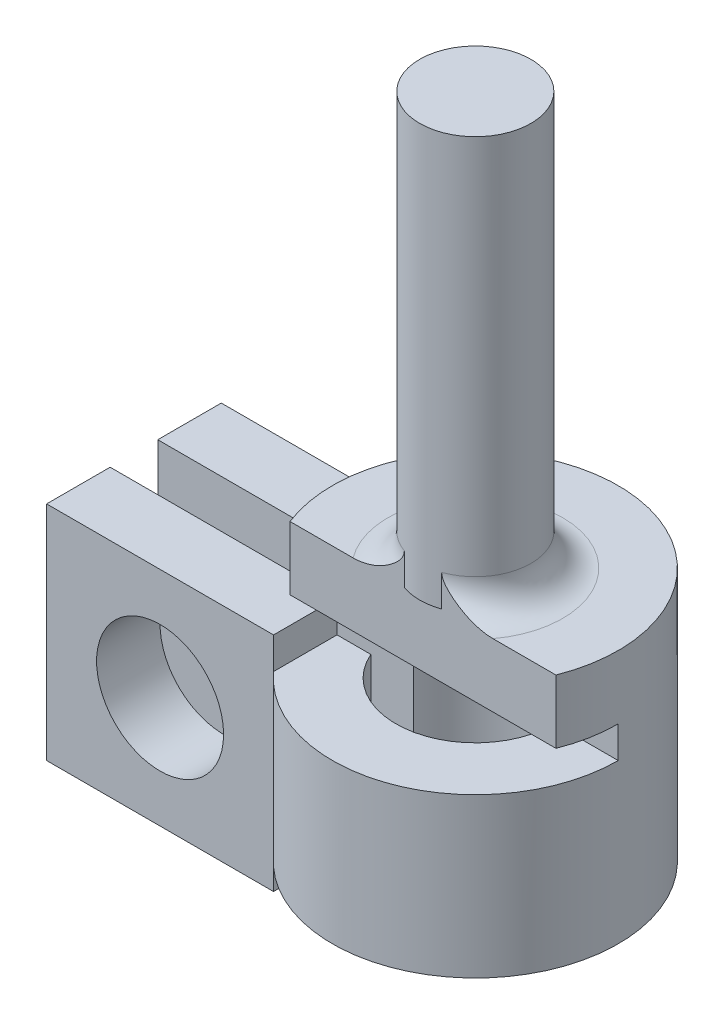
ISO-10303-21;
HEADER;
FILE_DESCRIPTION(('STEP AP214'),'2;1');
FILE_NAME('part.step','',(''),(''),'','','');
FILE_SCHEMA(('AUTOMOTIVE_DESIGN { 1 0 10303 214 1 1 1 1 }'));
ENDSEC;
DATA;
#1=APPLICATION_CONTEXT('core data for automotive mechanical design processes');
#2=APPLICATION_PROTOCOL_DEFINITION('international standard','automotive_design',2000,#1);
#3=PRODUCT_CONTEXT('',#1,'mechanical');
#4=PRODUCT('Part','Part','',(#3));
#5=PRODUCT_RELATED_PRODUCT_CATEGORY('part','',(#4));
#6=PRODUCT_DEFINITION_FORMATION('','',#4);
#7=PRODUCT_DEFINITION_CONTEXT('part definition',#1,'design');
#8=PRODUCT_DEFINITION('design','',#6,#7);
#9=PRODUCT_DEFINITION_SHAPE('','',#8);
#10=(LENGTH_UNIT() NAMED_UNIT(*) SI_UNIT(.MILLI.,.METRE.));
#11=(NAMED_UNIT(*) PLANE_ANGLE_UNIT() SI_UNIT($,.RADIAN.));
#12=(NAMED_UNIT(*) SI_UNIT($,.STERADIAN.) SOLID_ANGLE_UNIT());
#13=UNCERTAINTY_MEASURE_WITH_UNIT(LENGTH_MEASURE(1.E-05),#10,'distance_accuracy_value','');
#14=(GEOMETRIC_REPRESENTATION_CONTEXT(3) GLOBAL_UNCERTAINTY_ASSIGNED_CONTEXT((#13)) GLOBAL_UNIT_ASSIGNED_CONTEXT((#10,
#11,#12)) REPRESENTATION_CONTEXT('',''));
#15=CARTESIAN_POINT('',(0.,0.,0.));
#16=DIRECTION('',(0.,0.,1.));
#17=DIRECTION('',(1.,0.,0.));
#18=AXIS2_PLACEMENT_3D('',#15,#16,#17);
#19=CARTESIAN_POINT('',(0.,5.,0.));
#20=DIRECTION('',(0.,1.,0.));
#21=DIRECTION('',(0.,0.,1.));
#22=AXIS2_PLACEMENT_3D('',#19,#20,#21);
#23=PLANE('',#22);
#24=CARTESIAN_POINT('',(0.,5.,0.));
#25=DIRECTION('',(0.,1.,0.));
#26=DIRECTION('',(0.,0.,1.));
#27=AXIS2_PLACEMENT_3D('',#24,#25,#26);
#28=CIRCLE('',#27,4.5);
#29=CARTESIAN_POINT('',(-3.35410196624968,5.,3.));
#30=VERTEX_POINT('',#29);
#31=CARTESIAN_POINT('',(4.5,5.,0.));
#32=VERTEX_POINT('',#31);
#33=EDGE_CURVE('E391',#30,#32,#28,.T.);
#34=ORIENTED_EDGE('',*,*,#33,.T.);
#35=DIRECTION('',(1.,0.,0.));
#36=VECTOR('',#35,1.);
#37=CARTESIAN_POINT('',(4.5,5.,0.));
#38=LINE('',#37,#36);
#39=CARTESIAN_POINT('',(2.5,5.,0.));
#40=VERTEX_POINT('',#39);
#41=EDGE_CURVE('E269',#40,#32,#38,.T.);
#42=ORIENTED_EDGE('',*,*,#41,.F.);
#43=CARTESIAN_POINT('',(0.,5.,0.));
#44=DIRECTION('',(0.,-1.,0.));
#45=DIRECTION('',(0.,0.,1.));
#46=AXIS2_PLACEMENT_3D('',#43,#44,#45);
#47=CIRCLE('',#46,2.5);
#48=CARTESIAN_POINT('',(-2.29128784747792,5.,1.));
#49=VERTEX_POINT('',#48);
#50=EDGE_CURVE('E394',#40,#49,#47,.T.);
#51=ORIENTED_EDGE('',*,*,#50,.T.);
#52=DIRECTION('',(-1.,0.,0.));
#53=VECTOR('',#52,1.);
#54=CARTESIAN_POINT('',(-2.29128784747792,5.,1.));
#55=LINE('',#54,#53);
#56=CARTESIAN_POINT('',(-3.35410196624968,5.,1.));
#57=VERTEX_POINT('',#56);
#58=EDGE_CURVE('E398',#49,#57,#55,.T.);
#59=ORIENTED_EDGE('',*,*,#58,.T.);
#60=DIRECTION('',(0.,0.,1.));
#61=VECTOR('',#60,1.);
#62=CARTESIAN_POINT('',(-3.35410196624968,5.,-9.71552899715306));
#63=LINE('',#62,#61);
#64=EDGE_CURVE('E382',#57,#30,#63,.T.);
#65=ORIENTED_EDGE('',*,*,#64,.T.);
#66=EDGE_LOOP('',(#34,#42,#51,#59,#65));
#67=FACE_BOUND('',#66,.T.);
#68=ADVANCED_FACE('F39',(#67),#23,.T.);
#69=DIRECTION('',(-1.,0.,0.));
#70=VECTOR('',#69,1.);
#71=CARTESIAN_POINT('',(-10.5,5.,-2.5));
#72=LINE('',#71,#70);
#73=CARTESIAN_POINT('',(-3.69307071470621,5.,-2.5));
#74=VERTEX_POINT('',#73);
#75=CARTESIAN_POINT('',(-3.74165738677394,5.,-2.5));
#76=VERTEX_POINT('',#75);
#77=EDGE_CURVE('E365',#74,#76,#72,.T.);
#78=ORIENTED_EDGE('',*,*,#77,.F.);
#79=DIRECTION('',(-0.234521074707626,0.,0.972111035591089));
#80=VECTOR('',#79,1.);
#81=CARTESIAN_POINT('',(-4.17556924855944,5.,-0.499999999999998));
#82=LINE('',#81,#80);
#83=CARTESIAN_POINT('',(-3.66692263001969,5.,-2.60838617260741));
#84=VERTEX_POINT('',#83);
#85=EDGE_CURVE('E260',#84,#74,#82,.T.);
#86=ORIENTED_EDGE('',*,*,#85,.F.);
#87=EDGE_CURVE('E395',#84,#76,#28,.T.);
#88=ORIENTED_EDGE('',*,*,#87,.T.);
#89=EDGE_LOOP('',(#78,#86,#88));
#90=FACE_BOUND('',#89,.T.);
#91=ADVANCED_FACE('F503',(#90),#23,.T.);
#92=CARTESIAN_POINT('',(-3.74165738677394,5.,-2.5));
#93=DIRECTION('',(0.,0.,1.));
#94=DIRECTION('',(1.,0.,0.));
#95=AXIS2_PLACEMENT_3D('',#92,#93,#94);
#96=PLANE('',#95);
#97=CARTESIAN_POINT('',(-6.92705098312484,2.5,-2.5));
#98=DIRECTION('',(0.,0.,1.));
#99=DIRECTION('',(1.,0.,0.));
#100=AXIS2_PLACEMENT_3D('',#97,#98,#99);
#101=CIRCLE('',#100,2.);
#102=CARTESIAN_POINT('',(-4.92705098312484,2.5,-2.5));
#103=VERTEX_POINT('',#102);
#104=EDGE_CURVE('E303',#103,#103,#101,.T.);
#105=ORIENTED_EDGE('',*,*,#104,.T.);
#106=EDGE_LOOP('',(#105));
#107=FACE_BOUND('',#106,.T.);
#108=DIRECTION('',(0.,1.,0.));
#109=VECTOR('',#108,1.);
#110=CARTESIAN_POINT('',(-3.6930707147062,5.,-2.5));
#111=LINE('',#110,#109);
#112=CARTESIAN_POINT('',(-3.69307071470621,6.,-2.5));
#113=VERTEX_POINT('',#112);
#114=EDGE_CURVE('E287',#74,#113,#111,.T.);
#115=ORIENTED_EDGE('',*,*,#114,.F.);
#116=ORIENTED_EDGE('',*,*,#77,.T.);
#117=DIRECTION('',(0.,-1.,0.));
#118=VECTOR('',#117,1.);
#119=CARTESIAN_POINT('',(-3.74165738677394,5.,-2.5));
#120=LINE('',#119,#118);
#121=CARTESIAN_POINT('',(-3.74165738677394,0.,-2.5));
#122=VERTEX_POINT('',#121);
#123=EDGE_CURVE('E386',#76,#122,#120,.T.);
#124=ORIENTED_EDGE('',*,*,#123,.T.);
#125=DIRECTION('',(1.,0.,0.));
#126=VECTOR('',#125,1.);
#127=CARTESIAN_POINT('',(-10.5,0.,-2.5));
#128=LINE('',#127,#126);
#129=CARTESIAN_POINT('',(-3.35410196624968,0.,-2.5));
#130=VERTEX_POINT('',#129);
#131=EDGE_CURVE('E331',#122,#130,#128,.T.);
#132=ORIENTED_EDGE('',*,*,#131,.T.);
#133=DIRECTION('',(0.,-1.,0.));
#134=VECTOR('',#133,1.);
#135=CARTESIAN_POINT('',(-3.35410196624968,0.,-2.5));
#136=LINE('',#135,#134);
#137=CARTESIAN_POINT('',(-3.35410196624968,-1.,-2.5));
#138=VERTEX_POINT('',#137);
#139=EDGE_CURVE('E326',#130,#138,#136,.T.);
#140=ORIENTED_EDGE('',*,*,#139,.T.);
#141=DIRECTION('',(-1.,0.,0.));
#142=VECTOR('',#141,1.);
#143=CARTESIAN_POINT('',(-10.5,-1.,-2.5));
#144=LINE('',#143,#142);
#145=CARTESIAN_POINT('',(-10.5,-1.,-2.5));
#146=VERTEX_POINT('',#145);
#147=EDGE_CURVE('E329',#138,#146,#144,.T.);
#148=ORIENTED_EDGE('',*,*,#147,.T.);
#149=DIRECTION('',(0.,-1.,0.));
#150=VECTOR('',#149,1.);
#151=CARTESIAN_POINT('',(-10.5,5.,-2.5));
#152=LINE('',#151,#150);
#153=CARTESIAN_POINT('',(-10.5,6.,-2.5));
#154=VERTEX_POINT('',#153);
#155=EDGE_CURVE('E437',#154,#146,#152,.T.);
#156=ORIENTED_EDGE('',*,*,#155,.F.);
#157=DIRECTION('',(1.,0.,0.));
#158=VECTOR('',#157,1.);
#159=CARTESIAN_POINT('',(-10.5,6.,-2.5));
#160=LINE('',#159,#158);
#161=CARTESIAN_POINT('',(-3.74165738677394,6.,-2.5));
#162=VERTEX_POINT('',#161);
#163=EDGE_CURVE('E361',#154,#162,#160,.T.);
#164=ORIENTED_EDGE('',*,*,#163,.T.);
#165=EDGE_CURVE('E254',#162,#113,#160,.T.);
#166=ORIENTED_EDGE('',*,*,#165,.T.);
#167=EDGE_LOOP('',(#115,#116,#124,#132,#140,#148,#156,#164,#166));
#168=FACE_BOUND('',#167,.T.);
#169=ADVANCED_FACE('F530',(#107,#168),#96,.F.);
#170=CARTESIAN_POINT('',(-10.5,5.,1.));
#171=DIRECTION('',(1.,0.,0.));
#172=DIRECTION('',(0.,0.,-1.));
#173=AXIS2_PLACEMENT_3D('',#170,#171,#172);
#174=PLANE('',#173);
#175=DIRECTION('',(0.,0.,1.));
#176=VECTOR('',#175,1.);
#177=CARTESIAN_POINT('',(-10.5,-1.,-9.71552899715306));
#178=LINE('',#177,#176);
#179=CARTESIAN_POINT('',(-10.5,-1.,-0.499999999999999));
#180=VERTEX_POINT('',#179);
#181=EDGE_CURVE('E353',#146,#180,#178,.T.);
#182=ORIENTED_EDGE('',*,*,#181,.T.);
#183=DIRECTION('',(0.,-1.,0.));
#184=VECTOR('',#183,1.);
#185=CARTESIAN_POINT('',(-10.5,5.,-0.499999999999999));
#186=LINE('',#185,#184);
#187=CARTESIAN_POINT('',(-10.5,6.,-0.499999999999999));
#188=VERTEX_POINT('',#187);
#189=EDGE_CURVE('E434',#188,#180,#186,.T.);
#190=ORIENTED_EDGE('',*,*,#189,.F.);
#191=DIRECTION('',(0.,0.,1.));
#192=VECTOR('',#191,1.);
#193=CARTESIAN_POINT('',(-10.5,6.,-9.71552899715306));
#194=LINE('',#193,#192);
#195=EDGE_CURVE('E366',#154,#188,#194,.T.);
#196=ORIENTED_EDGE('',*,*,#195,.F.);
#197=ORIENTED_EDGE('',*,*,#155,.T.);
#198=EDGE_LOOP('',(#182,#190,#196,#197));
#199=FACE_BOUND('',#198,.T.);
#200=ADVANCED_FACE('F518',(#199),#174,.F.);
#201=CARTESIAN_POINT('',(-10.5,6.,-9.71552899715306));
#202=DIRECTION('',(0.,1.,0.));
#203=DIRECTION('',(0.,0.,1.));
#204=AXIS2_PLACEMENT_3D('',#201,#202,#203);
#205=PLANE('',#204);
#206=CARTESIAN_POINT('',(0.,6.,0.));
#207=DIRECTION('',(0.,1.,0.));
#208=DIRECTION('',(0.,0.,1.));
#209=AXIS2_PLACEMENT_3D('',#206,#207,#208);
#210=CIRCLE('',#209,4.5);
#211=CARTESIAN_POINT('',(-4.47213595499958,6.,-0.499999999999999));
#212=VERTEX_POINT('',#211);
#213=EDGE_CURVE('E565',#162,#212,#210,.T.);
#214=ORIENTED_EDGE('',*,*,#213,.F.);
#215=ORIENTED_EDGE('',*,*,#163,.F.);
#216=ORIENTED_EDGE('',*,*,#195,.T.);
#217=DIRECTION('',(-1.,0.,0.));
#218=VECTOR('',#217,1.);
#219=CARTESIAN_POINT('',(-0.499999999999995,6.,-0.499999999999999));
#220=LINE('',#219,#218);
#221=EDGE_CURVE('E312',#212,#188,#220,.T.);
#222=ORIENTED_EDGE('',*,*,#221,.F.);
#223=EDGE_LOOP('',(#214,#215,#216,#222));
#224=FACE_BOUND('',#223,.T.);
#225=ADVANCED_FACE('F497',(#224),#205,.T.);
#226=CARTESIAN_POINT('',(-3.35410196624968,0.,-9.71552899715306));
#227=DIRECTION('',(1.,0.,0.));
#228=DIRECTION('',(0.,0.,-1.));
#229=AXIS2_PLACEMENT_3D('',#226,#227,#228);
#230=PLANE('',#229);
#231=DIRECTION('',(0.,1.,0.));
#232=VECTOR('',#231,1.);
#233=CARTESIAN_POINT('',(-3.35410196624968,0.,-0.499999999999999));
#234=LINE('',#233,#232);
#235=CARTESIAN_POINT('',(-3.35410196624968,-1.,-0.499999999999998));
#236=VERTEX_POINT('',#235);
#237=CARTESIAN_POINT('',(-3.35410196624968,0.,-0.499999999999999));
#238=VERTEX_POINT('',#237);
#239=EDGE_CURVE('E322',#236,#238,#234,.T.);
#240=ORIENTED_EDGE('',*,*,#239,.F.);
#241=DIRECTION('',(0.,0.,1.));
#242=VECTOR('',#241,1.);
#243=CARTESIAN_POINT('',(-3.35410196624968,-1.,-9.71552899715306));
#244=LINE('',#243,#242);
#245=EDGE_CURVE('E348',#138,#236,#244,.T.);
#246=ORIENTED_EDGE('',*,*,#245,.F.);
#247=ORIENTED_EDGE('',*,*,#139,.F.);
#248=DIRECTION('',(0.,0.,1.));
#249=VECTOR('',#248,1.);
#250=CARTESIAN_POINT('',(-3.35410196624968,0.,-9.71552899715306));
#251=LINE('',#250,#249);
#252=EDGE_CURVE('E330',#130,#238,#251,.T.);
#253=ORIENTED_EDGE('',*,*,#252,.T.);
#254=EDGE_LOOP('',(#240,#246,#247,#253));
#255=FACE_BOUND('',#254,.T.);
#256=ADVANCED_FACE('F487',(#255),#230,.T.);
#257=CARTESIAN_POINT('',(-10.5,-1.,-9.71552899715306));
#258=DIRECTION('',(0.,-1.,0.));
#259=DIRECTION('',(0.,0.,-1.));
#260=AXIS2_PLACEMENT_3D('',#257,#258,#259);
#261=PLANE('',#260);
#262=DIRECTION('',(1.,0.,0.));
#263=VECTOR('',#262,1.);
#264=CARTESIAN_POINT('',(-10.5,-1.,-0.499999999999997));
#265=LINE('',#264,#263);
#266=EDGE_CURVE('E446',#180,#236,#265,.T.);
#267=ORIENTED_EDGE('',*,*,#266,.F.);
#268=ORIENTED_EDGE('',*,*,#181,.F.);
#269=ORIENTED_EDGE('',*,*,#147,.F.);
#270=ORIENTED_EDGE('',*,*,#245,.T.);
#271=EDGE_LOOP('',(#267,#268,#269,#270));
#272=FACE_BOUND('',#271,.T.);
#273=ADVANCED_FACE('F491',(#272),#261,.T.);
#274=CARTESIAN_POINT('',(0.,0.,0.));
#275=DIRECTION('',(0.,1.,0.));
#276=DIRECTION('',(0.,0.,1.));
#277=AXIS2_PLACEMENT_3D('',#274,#275,#276);
#278=PLANE('',#277);
#279=ORIENTED_EDGE('',*,*,#131,.F.);
#280=CARTESIAN_POINT('',(0.,0.,0.));
#281=DIRECTION('',(0.,1.,0.));
#282=DIRECTION('',(0.,0.,1.));
#283=AXIS2_PLACEMENT_3D('',#280,#281,#282);
#284=CIRCLE('',#283,4.5);
#285=CARTESIAN_POINT('',(-3.35410196624968,0.,3.));
#286=VERTEX_POINT('',#285);
#287=EDGE_CURVE('E390',#286,#122,#284,.T.);
#288=ORIENTED_EDGE('',*,*,#287,.F.);
#289=CARTESIAN_POINT('',(-3.35410196624968,0.,1.));
#290=VERTEX_POINT('',#289);
#291=EDGE_CURVE('E336',#290,#286,#251,.T.);
#292=ORIENTED_EDGE('',*,*,#291,.F.);
#293=DIRECTION('',(-1.,0.,0.));
#294=VECTOR('',#293,1.);
#295=CARTESIAN_POINT('',(-2.29128784747792,0.,1.));
#296=LINE('',#295,#294);
#297=CARTESIAN_POINT('',(-2.29128784747792,0.,1.));
#298=VERTEX_POINT('',#297);
#299=EDGE_CURVE('E412',#298,#290,#296,.T.);
#300=ORIENTED_EDGE('',*,*,#299,.F.);
#301=CARTESIAN_POINT('',(0.,0.,0.));
#302=DIRECTION('',(0.,-1.,0.));
#303=DIRECTION('',(0.,0.,1.));
#304=AXIS2_PLACEMENT_3D('',#301,#302,#303);
#305=CIRCLE('',#304,2.5);
#306=CARTESIAN_POINT('',(-2.44948974278318,0.,-0.499999999999999));
#307=VERTEX_POINT('',#306);
#308=EDGE_CURVE('E409',#307,#298,#305,.T.);
#309=ORIENTED_EDGE('',*,*,#308,.F.);
#310=DIRECTION('',(1.,0.,0.));
#311=VECTOR('',#310,1.);
#312=CARTESIAN_POINT('',(-10.5,0.,-0.499999999999999));
#313=LINE('',#312,#311);
#314=EDGE_CURVE('E406',#238,#307,#313,.T.);
#315=ORIENTED_EDGE('',*,*,#314,.F.);
#316=ORIENTED_EDGE('',*,*,#252,.F.);
#317=EDGE_LOOP('',(#279,#288,#292,#300,#309,#315,#316));
#318=FACE_BOUND('',#317,.T.);
#319=ADVANCED_FACE('F505',(#318),#278,.F.);
#320=CARTESIAN_POINT('',(0.,5.,0.));
#321=DIRECTION('',(0.,-1.,0.));
#322=DIRECTION('',(0.,0.,-1.));
#323=AXIS2_PLACEMENT_3D('',#320,#321,#322);
#324=CYLINDRICAL_SURFACE('',#323,4.5);
#325=ORIENTED_EDGE('',*,*,#287,.T.);
#326=ORIENTED_EDGE('',*,*,#123,.F.);
#327=ORIENTED_EDGE('',*,*,#87,.F.);
#328=DIRECTION('',(0.,-1.,0.));
#329=VECTOR('',#328,1.);
#330=CARTESIAN_POINT('',(-3.66692263001969,6.,-2.60838617260741));
#331=LINE('',#330,#329);
#332=CARTESIAN_POINT('',(-3.66692263001969,6.,-2.60838617260741));
#333=VERTEX_POINT('',#332);
#334=EDGE_CURVE('E268',#333,#84,#331,.T.);
#335=ORIENTED_EDGE('',*,*,#334,.F.);
#336=EDGE_CURVE('E243',#333,#162,#210,.T.);
#337=ORIENTED_EDGE('',*,*,#336,.T.);
#338=ORIENTED_EDGE('',*,*,#213,.T.);
#339=CARTESIAN_POINT('',(-4.38748219369606,6.,1.));
#340=VERTEX_POINT('',#339);
#341=EDGE_CURVE('E228',#212,#340,#210,.T.);
#342=ORIENTED_EDGE('',*,*,#341,.T.);
#343=CARTESIAN_POINT('',(-4.18738186490479,6.,1.64797849423665));
#344=VERTEX_POINT('',#343);
#345=EDGE_CURVE('E244',#340,#344,#210,.T.);
#346=ORIENTED_EDGE('',*,*,#345,.T.);
#347=DIRECTION('',(0.,-1.,0.));
#348=VECTOR('',#347,1.);
#349=CARTESIAN_POINT('',(-4.18738186490479,8.,1.64797849423665));
#350=LINE('',#349,#348);
#351=CARTESIAN_POINT('',(-4.18738186490479,8.,1.64797849423665));
#352=VERTEX_POINT('',#351);
#353=EDGE_CURVE('E250',#352,#344,#350,.T.);
#354=ORIENTED_EDGE('',*,*,#353,.F.);
#355=CARTESIAN_POINT('',(0.,8.,0.));
#356=DIRECTION('',(0.,1.,0.));
#357=DIRECTION('',(0.,0.,1.));
#358=AXIS2_PLACEMENT_3D('',#355,#356,#357);
#359=CIRCLE('',#358,4.5);
#360=CARTESIAN_POINT('',(4.18738186490479,8.,1.64797849423665));
#361=VERTEX_POINT('',#360);
#362=EDGE_CURVE('E231',#361,#352,#359,.T.);
#363=ORIENTED_EDGE('',*,*,#362,.F.);
#364=DIRECTION('',(0.,-1.,0.));
#365=VECTOR('',#364,1.);
#366=CARTESIAN_POINT('',(4.18738186490479,8.,1.64797849423665));
#367=LINE('',#366,#365);
#368=CARTESIAN_POINT('',(4.18738186490479,6.,1.64797849423665));
#369=VERTEX_POINT('',#368);
#370=EDGE_CURVE('E237',#361,#369,#367,.T.);
#371=ORIENTED_EDGE('',*,*,#370,.T.);
#372=CARTESIAN_POINT('',(4.5,6.,0.));
#373=VERTEX_POINT('',#372);
#374=EDGE_CURVE('E238',#369,#373,#210,.T.);
#375=ORIENTED_EDGE('',*,*,#374,.T.);
#376=DIRECTION('',(0.,-1.,0.));
#377=VECTOR('',#376,1.);
#378=CARTESIAN_POINT('',(4.5,6.,0.));
#379=LINE('',#378,#377);
#380=EDGE_CURVE('E279',#373,#32,#379,.T.);
#381=ORIENTED_EDGE('',*,*,#380,.T.);
#382=ORIENTED_EDGE('',*,*,#33,.F.);
#383=DIRECTION('',(0.,-1.,0.));
#384=VECTOR('',#383,1.);
#385=CARTESIAN_POINT('',(-3.35410196624968,5.,3.));
#386=LINE('',#385,#384);
#387=EDGE_CURVE('E402',#30,#286,#386,.T.);
#388=ORIENTED_EDGE('',*,*,#387,.T.);
#389=EDGE_LOOP('',(#325,#326,#327,#335,#337,#338,#342,#346,#354,#363,#371,#375,#381,#382,#388));
#390=FACE_BOUND('',#389,.T.);
#391=ADVANCED_FACE('F508',(#390),#324,.T.);
#392=CARTESIAN_POINT('',(-10.5,5.,-0.499999999999999));
#393=DIRECTION('',(0.,0.,-1.));
#394=DIRECTION('',(-1.,0.,0.));
#395=AXIS2_PLACEMENT_3D('',#392,#393,#394);
#396=PLANE('',#395);
#397=DIRECTION('',(0.,-1.,0.));
#398=VECTOR('',#397,1.);
#399=CARTESIAN_POINT('',(-2.44948974278318,5.,-0.499999999999999));
#400=LINE('',#399,#398);
#401=CARTESIAN_POINT('',(-2.44948974278318,6.,-0.499999999999999));
#402=VERTEX_POINT('',#401);
#403=EDGE_CURVE('E430',#402,#307,#400,.T.);
#404=ORIENTED_EDGE('',*,*,#403,.F.);
#405=EDGE_CURVE('E308',#402,#212,#220,.T.);
#406=ORIENTED_EDGE('',*,*,#405,.T.);
#407=ORIENTED_EDGE('',*,*,#221,.T.);
#408=ORIENTED_EDGE('',*,*,#189,.T.);
#409=ORIENTED_EDGE('',*,*,#266,.T.);
#410=ORIENTED_EDGE('',*,*,#239,.T.);
#411=ORIENTED_EDGE('',*,*,#314,.T.);
#412=EDGE_LOOP('',(#404,#406,#407,#408,#409,#410,#411));
#413=FACE_BOUND('',#412,.T.);
#414=CARTESIAN_POINT('',(-6.92705098312484,2.5,-0.499999999999999));
#415=DIRECTION('',(0.,0.,-1.));
#416=DIRECTION('',(-1.,0.,0.));
#417=AXIS2_PLACEMENT_3D('',#414,#415,#416);
#418=CIRCLE('',#417,2.);
#419=CARTESIAN_POINT('',(-8.92705098312484,2.5,-0.499999999999999));
#420=VERTEX_POINT('',#419);
#421=EDGE_CURVE('E299',#420,#420,#418,.T.);
#422=ORIENTED_EDGE('',*,*,#421,.T.);
#423=EDGE_LOOP('',(#422));
#424=FACE_BOUND('',#423,.T.);
#425=ADVANCED_FACE('F525',(#413,#424),#396,.F.);
#426=CARTESIAN_POINT('',(0.,5.,0.));
#427=DIRECTION('',(0.,-1.,0.));
#428=DIRECTION('',(0.,0.,-1.));
#429=AXIS2_PLACEMENT_3D('',#426,#427,#428);
#430=CYLINDRICAL_SURFACE('',#429,2.5);
#431=ORIENTED_EDGE('',*,*,#308,.T.);
#432=DIRECTION('',(0.,-1.,0.));
#433=VECTOR('',#432,1.);
#434=CARTESIAN_POINT('',(-2.29128784747792,5.,1.));
#435=LINE('',#434,#433);
#436=EDGE_CURVE('E426',#49,#298,#435,.T.);
#437=ORIENTED_EDGE('',*,*,#436,.F.);
#438=ORIENTED_EDGE('',*,*,#50,.F.);
#439=DIRECTION('',(0.,-1.,0.));
#440=VECTOR('',#439,1.);
#441=CARTESIAN_POINT('',(2.5,6.,0.));
#442=LINE('',#441,#440);
#443=CARTESIAN_POINT('',(2.5,6.,0.));
#444=VERTEX_POINT('',#443);
#445=EDGE_CURVE('E283',#444,#40,#442,.T.);
#446=ORIENTED_EDGE('',*,*,#445,.F.);
#447=CARTESIAN_POINT('',(0.,6.,0.));
#448=DIRECTION('',(0.,-1.,0.));
#449=DIRECTION('',(0.,0.,1.));
#450=AXIS2_PLACEMENT_3D('',#447,#448,#449);
#451=CIRCLE('',#450,2.5);
#452=EDGE_CURVE('E255',#402,#444,#451,.T.);
#453=ORIENTED_EDGE('',*,*,#452,.F.);
#454=ORIENTED_EDGE('',*,*,#403,.T.);
#455=EDGE_LOOP('',(#431,#437,#438,#446,#453,#454));
#456=FACE_BOUND('',#455,.T.);
#457=ADVANCED_FACE('F521',(#456),#430,.F.);
#458=CARTESIAN_POINT('',(-2.29128784747792,5.,1.));
#459=DIRECTION('',(0.,0.,1.));
#460=DIRECTION('',(1.,0.,0.));
#461=AXIS2_PLACEMENT_3D('',#458,#459,#460);
#462=PLANE('',#461);
#463=CARTESIAN_POINT('',(-6.92705098312484,2.5,1.));
#464=DIRECTION('',(0.,0.,1.));
#465=DIRECTION('',(1.,0.,0.));
#466=AXIS2_PLACEMENT_3D('',#463,#464,#465);
#467=CIRCLE('',#466,2.);
#468=CARTESIAN_POINT('',(-4.92705098312484,2.5,1.));
#469=VERTEX_POINT('',#468);
#470=EDGE_CURVE('E295',#469,#469,#467,.T.);
#471=ORIENTED_EDGE('',*,*,#470,.T.);
#472=EDGE_LOOP('',(#471));
#473=FACE_BOUND('',#472,.T.);
#474=ORIENTED_EDGE('',*,*,#299,.T.);
#475=DIRECTION('',(0.,-1.,0.));
#476=VECTOR('',#475,1.);
#477=CARTESIAN_POINT('',(-3.35410196624968,0.,1.));
#478=LINE('',#477,#476);
#479=CARTESIAN_POINT('',(-3.35410196624968,-1.,1.));
#480=VERTEX_POINT('',#479);
#481=EDGE_CURVE('E311',#290,#480,#478,.T.);
#482=ORIENTED_EDGE('',*,*,#481,.T.);
#483=DIRECTION('',(-1.,0.,0.));
#484=VECTOR('',#483,1.);
#485=CARTESIAN_POINT('',(-10.5,-1.,1.));
#486=LINE('',#485,#484);
#487=CARTESIAN_POINT('',(-10.5,-1.,1.));
#488=VERTEX_POINT('',#487);
#489=EDGE_CURVE('E335',#480,#488,#486,.T.);
#490=ORIENTED_EDGE('',*,*,#489,.T.);
#491=DIRECTION('',(0.,-1.,0.));
#492=VECTOR('',#491,1.);
#493=CARTESIAN_POINT('',(-10.5,5.,1.));
#494=LINE('',#493,#492);
#495=CARTESIAN_POINT('',(-10.5,6.,1.));
#496=VERTEX_POINT('',#495);
#497=EDGE_CURVE('E423',#496,#488,#494,.T.);
#498=ORIENTED_EDGE('',*,*,#497,.F.);
#499=DIRECTION('',(-1.,0.,0.));
#500=VECTOR('',#499,1.);
#501=CARTESIAN_POINT('',(-0.499999999999995,6.,1.));
#502=LINE('',#501,#500);
#503=EDGE_CURVE('E307',#340,#496,#502,.T.);
#504=ORIENTED_EDGE('',*,*,#503,.F.);
#505=CARTESIAN_POINT('',(-3.35410196624968,6.,1.));
#506=VERTEX_POINT('',#505);
#507=EDGE_CURVE('E313',#506,#340,#502,.T.);
#508=ORIENTED_EDGE('',*,*,#507,.F.);
#509=DIRECTION('',(0.,-1.,0.));
#510=VECTOR('',#509,1.);
#511=CARTESIAN_POINT('',(-3.35410196624968,5.,1.));
#512=LINE('',#511,#510);
#513=EDGE_CURVE('E319',#506,#57,#512,.T.);
#514=ORIENTED_EDGE('',*,*,#513,.T.);
#515=ORIENTED_EDGE('',*,*,#58,.F.);
#516=ORIENTED_EDGE('',*,*,#436,.T.);
#517=EDGE_LOOP('',(#474,#482,#490,#498,#504,#508,#514,#515,#516));
#518=FACE_BOUND('',#517,.T.);
#519=ADVANCED_FACE('F516',(#473,#518),#462,.F.);
#520=CARTESIAN_POINT('',(-10.5,6.,3.));
#521=VERTEX_POINT('',#520);
#522=EDGE_CURVE('E378',#496,#521,#194,.T.);
#523=ORIENTED_EDGE('',*,*,#522,.F.);
#524=ORIENTED_EDGE('',*,*,#497,.T.);
#525=CARTESIAN_POINT('',(-10.5,-1.,3.));
#526=VERTEX_POINT('',#525);
#527=EDGE_CURVE('E344',#488,#526,#178,.T.);
#528=ORIENTED_EDGE('',*,*,#527,.T.);
#529=DIRECTION('',(0.,-1.,0.));
#530=VECTOR('',#529,1.);
#531=CARTESIAN_POINT('',(-10.5,5.,3.));
#532=LINE('',#531,#530);
#533=EDGE_CURVE('E419',#521,#526,#532,.T.);
#534=ORIENTED_EDGE('',*,*,#533,.F.);
#535=EDGE_LOOP('',(#523,#524,#528,#534));
#536=FACE_BOUND('',#535,.T.);
#537=ADVANCED_FACE('F512',(#536),#174,.F.);
#538=CARTESIAN_POINT('',(-10.5,5.,3.));
#539=DIRECTION('',(0.,0.,-1.));
#540=DIRECTION('',(-1.,0.,0.));
#541=AXIS2_PLACEMENT_3D('',#538,#539,#540);
#542=PLANE('',#541);
#543=CARTESIAN_POINT('',(-6.92705098312484,2.5,3.));
#544=DIRECTION('',(0.,0.,1.));
#545=DIRECTION('',(1.,0.,0.));
#546=AXIS2_PLACEMENT_3D('',#543,#544,#545);
#547=CIRCLE('',#546,2.);
#548=CARTESIAN_POINT('',(-4.92705098312484,2.5,3.));
#549=VERTEX_POINT('',#548);
#550=EDGE_CURVE('E291',#549,#549,#547,.T.);
#551=ORIENTED_EDGE('',*,*,#550,.F.);
#552=EDGE_LOOP('',(#551));
#553=FACE_BOUND('',#552,.T.);
#554=ORIENTED_EDGE('',*,*,#533,.T.);
#555=DIRECTION('',(1.,0.,0.));
#556=VECTOR('',#555,1.);
#557=CARTESIAN_POINT('',(-10.5,-1.,3.));
#558=LINE('',#557,#556);
#559=CARTESIAN_POINT('',(-3.35410196624968,-1.,3.));
#560=VERTEX_POINT('',#559);
#561=EDGE_CURVE('E325',#526,#560,#558,.T.);
#562=ORIENTED_EDGE('',*,*,#561,.T.);
#563=DIRECTION('',(0.,1.,0.));
#564=VECTOR('',#563,1.);
#565=CARTESIAN_POINT('',(-3.35410196624968,0.,3.));
#566=LINE('',#565,#564);
#567=EDGE_CURVE('E340',#560,#286,#566,.T.);
#568=ORIENTED_EDGE('',*,*,#567,.T.);
#569=ORIENTED_EDGE('',*,*,#387,.F.);
#570=DIRECTION('',(0.,1.,0.));
#571=VECTOR('',#570,1.);
#572=CARTESIAN_POINT('',(-3.35410196624968,5.,3.));
#573=LINE('',#572,#571);
#574=CARTESIAN_POINT('',(-3.35410196624968,6.,3.));
#575=VERTEX_POINT('',#574);
#576=EDGE_CURVE('E360',#30,#575,#573,.T.);
#577=ORIENTED_EDGE('',*,*,#576,.T.);
#578=DIRECTION('',(-1.,0.,0.));
#579=VECTOR('',#578,1.);
#580=CARTESIAN_POINT('',(-10.5,6.,3.));
#581=LINE('',#580,#579);
#582=EDGE_CURVE('E370',#575,#521,#581,.T.);
#583=ORIENTED_EDGE('',*,*,#582,.T.);
#584=EDGE_LOOP('',(#554,#562,#568,#569,#577,#583));
#585=FACE_BOUND('',#584,.T.);
#586=ADVANCED_FACE('F495',(#553,#585),#542,.F.);
#587=ORIENTED_EDGE('',*,*,#345,.F.);
#588=ORIENTED_EDGE('',*,*,#503,.T.);
#589=ORIENTED_EDGE('',*,*,#522,.T.);
#590=ORIENTED_EDGE('',*,*,#582,.F.);
#591=DIRECTION('',(0.,0.,1.));
#592=VECTOR('',#591,1.);
#593=CARTESIAN_POINT('',(-3.35410196624968,6.,-9.71552899715306));
#594=LINE('',#593,#592);
#595=CARTESIAN_POINT('',(-3.35410196624968,6.,1.64797849423665));
#596=VERTEX_POINT('',#595);
#597=EDGE_CURVE('E374',#596,#575,#594,.T.);
#598=ORIENTED_EDGE('',*,*,#597,.F.);
#599=DIRECTION('',(1.,0.,0.));
#600=VECTOR('',#599,1.);
#601=CARTESIAN_POINT('',(-4.18738186490479,6.,1.64797849423665));
#602=LINE('',#601,#600);
#603=EDGE_CURVE('E234',#344,#596,#602,.T.);
#604=ORIENTED_EDGE('',*,*,#603,.F.);
#605=EDGE_LOOP('',(#587,#588,#589,#590,#598,#604));
#606=FACE_BOUND('',#605,.T.);
#607=ADVANCED_FACE('F492',(#606),#205,.T.);
#608=CARTESIAN_POINT('',(-3.35410196624968,5.,-9.71552899715306));
#609=DIRECTION('',(1.,0.,0.));
#610=DIRECTION('',(0.,0.,-1.));
#611=AXIS2_PLACEMENT_3D('',#608,#609,#610);
#612=PLANE('',#611);
#613=ORIENTED_EDGE('',*,*,#513,.F.);
#614=EDGE_CURVE('E379',#506,#596,#594,.T.);
#615=ORIENTED_EDGE('',*,*,#614,.T.);
#616=ORIENTED_EDGE('',*,*,#597,.T.);
#617=ORIENTED_EDGE('',*,*,#576,.F.);
#618=ORIENTED_EDGE('',*,*,#64,.F.);
#619=EDGE_LOOP('',(#613,#615,#616,#617,#618));
#620=FACE_BOUND('',#619,.T.);
#621=ADVANCED_FACE('F485',(#620),#612,.T.);
#622=ORIENTED_EDGE('',*,*,#481,.F.);
#623=ORIENTED_EDGE('',*,*,#291,.T.);
#624=ORIENTED_EDGE('',*,*,#567,.F.);
#625=EDGE_CURVE('E352',#480,#560,#244,.T.);
#626=ORIENTED_EDGE('',*,*,#625,.F.);
#627=EDGE_LOOP('',(#622,#623,#624,#626));
#628=FACE_BOUND('',#627,.T.);
#629=ADVANCED_FACE('F481',(#628),#230,.T.);
#630=ORIENTED_EDGE('',*,*,#489,.F.);
#631=ORIENTED_EDGE('',*,*,#625,.T.);
#632=ORIENTED_EDGE('',*,*,#561,.F.);
#633=ORIENTED_EDGE('',*,*,#527,.F.);
#634=EDGE_LOOP('',(#630,#631,#632,#633));
#635=FACE_BOUND('',#634,.T.);
#636=ADVANCED_FACE('F484',(#635),#261,.T.);
#637=CARTESIAN_POINT('',(-6.92705098312484,2.5,-7.));
#638=DIRECTION('',(0.,0.,1.));
#639=DIRECTION('',(1.,0.,0.));
#640=AXIS2_PLACEMENT_3D('',#637,#638,#639);
#641=CYLINDRICAL_SURFACE('',#640,2.);
#642=ORIENTED_EDGE('',*,*,#550,.T.);
#643=EDGE_LOOP('',(#642));
#644=FACE_BOUND('',#643,.T.);
#645=ORIENTED_EDGE('',*,*,#470,.F.);
#646=EDGE_LOOP('',(#645));
#647=FACE_BOUND('',#646,.T.);
#648=ADVANCED_FACE('F479',(#644,#647),#641,.F.);
#649=ORIENTED_EDGE('',*,*,#421,.F.);
#650=EDGE_LOOP('',(#649));
#651=FACE_BOUND('',#650,.T.);
#652=ORIENTED_EDGE('',*,*,#104,.F.);
#653=EDGE_LOOP('',(#652));
#654=FACE_BOUND('',#653,.T.);
#655=ADVANCED_FACE('F472',(#651,#654),#641,.F.);
#656=CARTESIAN_POINT('',(-4.17556924855944,6.,-0.499999999999998));
#657=DIRECTION('',(0.97211103559109,0.,0.234521074707626));
#658=DIRECTION('',(0.234521074707626,0.,-0.972111035591089));
#659=AXIS2_PLACEMENT_3D('',#656,#657,#658);
#660=PLANE('',#659);
#661=ORIENTED_EDGE('',*,*,#85,.T.);
#662=ORIENTED_EDGE('',*,*,#114,.T.);
#663=DIRECTION('',(-0.234521074707626,0.,0.972111035591089));
#664=VECTOR('',#663,1.);
#665=CARTESIAN_POINT('',(-4.17556924855944,6.,-0.499999999999998));
#666=LINE('',#665,#664);
#667=EDGE_CURVE('E264',#333,#113,#666,.T.);
#668=ORIENTED_EDGE('',*,*,#667,.F.);
#669=ORIENTED_EDGE('',*,*,#334,.T.);
#670=EDGE_LOOP('',(#661,#662,#668,#669));
#671=FACE_BOUND('',#670,.T.);
#672=ADVANCED_FACE('F467',(#671),#660,.F.);
#673=CARTESIAN_POINT('',(4.5,6.,0.));
#674=DIRECTION('',(0.,0.,-1.));
#675=DIRECTION('',(-1.,0.,0.));
#676=AXIS2_PLACEMENT_3D('',#673,#674,#675);
#677=PLANE('',#676);
#678=ORIENTED_EDGE('',*,*,#41,.T.);
#679=ORIENTED_EDGE('',*,*,#380,.F.);
#680=DIRECTION('',(1.,0.,0.));
#681=VECTOR('',#680,1.);
#682=CARTESIAN_POINT('',(4.5,6.,0.));
#683=LINE('',#682,#681);
#684=EDGE_CURVE('E259',#444,#373,#683,.T.);
#685=ORIENTED_EDGE('',*,*,#684,.F.);
#686=ORIENTED_EDGE('',*,*,#445,.T.);
#687=EDGE_LOOP('',(#678,#679,#685,#686));
#688=FACE_BOUND('',#687,.T.);
#689=ADVANCED_FACE('F471',(#688),#677,.F.);
#690=CARTESIAN_POINT('',(0.,6.,0.));
#691=DIRECTION('',(0.,1.,0.));
#692=DIRECTION('',(0.,0.,1.));
#693=AXIS2_PLACEMENT_3D('',#690,#691,#692);
#694=PLANE('',#693);
#695=ORIENTED_EDGE('',*,*,#336,.F.);
#696=ORIENTED_EDGE('',*,*,#667,.T.);
#697=ORIENTED_EDGE('',*,*,#165,.F.);
#698=EDGE_LOOP('',(#695,#696,#697));
#699=FACE_BOUND('',#698,.T.);
#700=ADVANCED_FACE('F465',(#699),#694,.F.);
#701=ORIENTED_EDGE('',*,*,#405,.F.);
#702=ORIENTED_EDGE('',*,*,#452,.T.);
#703=ORIENTED_EDGE('',*,*,#684,.T.);
#704=ORIENTED_EDGE('',*,*,#374,.F.);
#705=EDGE_CURVE('E242',#596,#369,#602,.T.);
#706=ORIENTED_EDGE('',*,*,#705,.F.);
#707=ORIENTED_EDGE('',*,*,#614,.F.);
#708=ORIENTED_EDGE('',*,*,#507,.T.);
#709=ORIENTED_EDGE('',*,*,#341,.F.);
#710=EDGE_LOOP('',(#701,#702,#703,#704,#706,#707,#708,#709));
#711=FACE_BOUND('',#710,.T.);
#712=ADVANCED_FACE('F464',(#711),#694,.F.);
#713=CARTESIAN_POINT('',(-4.18738186490479,8.,1.64797849423665));
#714=DIRECTION('',(0.,0.,-1.));
#715=DIRECTION('',(-1.,0.,0.));
#716=AXIS2_PLACEMENT_3D('',#713,#714,#715);
#717=PLANE('',#716);
#718=ORIENTED_EDGE('',*,*,#603,.T.);
#719=ORIENTED_EDGE('',*,*,#705,.T.);
#720=ORIENTED_EDGE('',*,*,#370,.F.);
#721=DIRECTION('',(1.,0.,0.));
#722=VECTOR('',#721,1.);
#723=CARTESIAN_POINT('',(-4.18738186490479,8.,1.64797849423665));
#724=LINE('',#723,#722);
#725=CARTESIAN_POINT('',(2.20151467915467,8.,1.64797849423665));
#726=VERTEX_POINT('',#725);
#727=EDGE_CURVE('E220',#726,#361,#724,.T.);
#728=ORIENTED_EDGE('',*,*,#727,.F.);
#729=CARTESIAN_POINT('',(2.20151467915467,8.,1.64797849423665));
#730=CARTESIAN_POINT('',(2.11674396457505,8.00001867703782,1.64797849423665));
#731=CARTESIAN_POINT('',(2.03226991184011,8.00689452326879,1.64797849423665));
#732=CARTESIAN_POINT('',(1.86519785414625,8.03264661540042,1.64797849423665));
#733=CARTESIAN_POINT('',(1.78259852010137,8.0515140659068,1.64797849423665));
#734=CARTESIAN_POINT('',(1.58219949709897,8.11086276674876,1.64797849423665));
#735=CARTESIAN_POINT('',(1.46616584787105,8.15734047294603,1.64797849423665));
#736=CARTESIAN_POINT('',(1.29908427411194,8.24045304832173,1.64797849423665));
#737=CARTESIAN_POINT('',(1.24453572984745,8.27040151744004,1.64797849423665));
#738=CARTESIAN_POINT('',(1.13798544561025,8.33451893479304,1.64797849423665));
#739=CARTESIAN_POINT('',(1.08598212606431,8.36868521784639,1.64797849423665));
#740=CARTESIAN_POINT('',(0.996232803126504,8.43317953497458,1.64797849423665));
#741=CARTESIAN_POINT('',(0.957885162856851,8.46267509638905,1.64797849423665));
#742=CARTESIAN_POINT('',(0.883396192595093,8.52452836197923,1.64797849423665));
#743=CARTESIAN_POINT('',(0.8472596523623,8.556891931997,1.64797849423665));
#744=CARTESIAN_POINT('',(0.777888736796484,8.6253142882006,1.64797849423665));
#745=CARTESIAN_POINT('',(0.744689606365868,8.66140895237551,1.64797849423665));
#746=CARTESIAN_POINT('',(0.683948449561936,8.73814798468048,1.64797849423665));
#747=CARTESIAN_POINT('',(0.656376826483292,8.77876671657136,1.64797849423665));
#748=CARTESIAN_POINT('',(0.624465349532889,8.84234479969331,1.64797849423665));
#749=CARTESIAN_POINT('',(0.615621953573159,8.86298888013781,1.64797849423665));
#750=CARTESIAN_POINT('',(0.601361781553552,8.9053908427999,1.64797849423665));
#751=CARTESIAN_POINT('',(0.595929627675519,8.92714324158987,1.64797849423665));
#752=CARTESIAN_POINT('',(0.591348383027563,8.95759015733484,1.64797849423665));
#753=CARTESIAN_POINT('',(0.590391564001942,8.9660297543009,1.64797849423665));
#754=CARTESIAN_POINT('',(0.589107928581034,8.98297802312649,1.64797849423665));
#755=CARTESIAN_POINT('',(0.588782713312863,8.99148681577,1.64797849423665));
#756=CARTESIAN_POINT('',(0.588784241070956,9.,1.64797849423665));
#757=B_SPLINE_CURVE_WITH_KNOTS('',3,(#729,#730,#731,#732,#733,#734,#735,#736,#737,#738,#739,
#740,#741,#742,#743,#744,#745,#746,#747,#748,#749,#750,#751,#752,#753,#754,#755,#756),
.UNSPECIFIED.,.F.,.F.,(4,2,2,2,2,2,2,2,2,2,2,2,2,4),(0.,0.253583654228868,0.506981528613545,
0.879857469882899,1.06641363604597,1.25285251747672,1.39789024107964,1.54323177156372,
1.69013060986507,1.83623573891831,1.90340557021949,1.9702703854437,1.99573104854312,
2.02125617107394),.UNSPECIFIED.);
#758=CARTESIAN_POINT('',(0.588784241070958,9.,1.64797849423665));
#759=VERTEX_POINT('',#758);
#760=EDGE_CURVE('E11',#726,#759,#757,.T.);
#761=ORIENTED_EDGE('',*,*,#760,.T.);
#762=DIRECTION('',(0.,-1.,0.));
#763=VECTOR('',#762,1.);
#764=CARTESIAN_POINT('',(0.588784241070958,8.,1.64797849423665));
#765=LINE('',#764,#763);
#766=CARTESIAN_POINT('',(0.588784241070958,8.,1.64797849423665));
#767=VERTEX_POINT('',#766);
#768=EDGE_CURVE('E60',#767,#759,#765,.F.);
#769=ORIENTED_EDGE('',*,*,#768,.F.);
#770=CARTESIAN_POINT('',(-0.588784241070958,8.,1.64797849423665));
#771=VERTEX_POINT('',#770);
#772=EDGE_CURVE('E214',#771,#767,#724,.T.);
#773=ORIENTED_EDGE('',*,*,#772,.F.);
#774=DIRECTION('',(0.,-1.,0.));
#775=VECTOR('',#774,1.);
#776=CARTESIAN_POINT('',(-0.588784241070958,9.,1.64797849423665));
#777=LINE('',#776,#775);
#778=CARTESIAN_POINT('',(-0.588784241070958,9.,1.64797849423665));
#779=VERTEX_POINT('',#778);
#780=EDGE_CURVE('E204',#779,#771,#777,.T.);
#781=ORIENTED_EDGE('',*,*,#780,.F.);
#782=CARTESIAN_POINT('',(-0.588784241070958,9.,1.64797849423665));
#783=CARTESIAN_POINT('',(-0.58867492498261,8.9757949800689,1.64797849423665));
#784=CARTESIAN_POINT('',(-0.591395695341382,8.95179353187811,1.64797849423665));
#785=CARTESIAN_POINT('',(-0.6012961985585,8.90522534387172,1.64797849423665));
#786=CARTESIAN_POINT('',(-0.608380905889832,8.88263904237156,1.64797849423665));
#787=CARTESIAN_POINT('',(-0.629629778731784,8.82953606894788,1.64797849423665));
#788=CARTESIAN_POINT('',(-0.64552441193113,8.79974344136456,1.64797849423665));
#789=CARTESIAN_POINT('',(-0.681537323073681,8.74251346625941,1.64797849423665));
#790=CARTESIAN_POINT('',(-0.70170123460953,8.71510648747128,1.64797849423665));
#791=CARTESIAN_POINT('',(-0.752020591240363,8.65335314546415,1.64797849423665));
#792=CARTESIAN_POINT('',(-0.783223524395916,8.61987353215261,1.64797849423665));
#793=CARTESIAN_POINT('',(-0.848529813190377,8.55583427952415,1.64797849423665));
#794=CARTESIAN_POINT('',(-0.882638402614528,8.52528012920144,1.64797849423665));
#795=CARTESIAN_POINT('',(-0.952991801370831,8.4666256039633,1.64797849423665));
#796=CARTESIAN_POINT('',(-0.989240088479713,8.43852941890931,1.64797849423665));
#797=CARTESIAN_POINT('',(-1.06341776138157,8.38464671156046,1.64797849423665));
#798=CARTESIAN_POINT('',(-1.10134763253208,8.35886086267406,1.64797849423665));
#799=CARTESIAN_POINT('',(-1.19319690140937,8.30029990016876,1.64797849423665));
#800=CARTESIAN_POINT('',(-1.24776970224005,8.26853864670727,1.64797849423665));
#801=CARTESIAN_POINT('',(-1.35930963091521,8.20954042683983,1.64797849423665));
#802=CARTESIAN_POINT('',(-1.41627813648234,8.18230610962963,1.64797849423665));
#803=CARTESIAN_POINT('',(-1.58972487270203,8.1083556183369,1.64797849423665));
#804=CARTESIAN_POINT('',(-1.70952286439586,8.0688894647304,1.64797849423665));
#805=CARTESIAN_POINT('',(-1.89247005741271,8.028312170298,1.64797849423665));
#806=CARTESIAN_POINT('',(-1.95363888832568,8.01789747039983,1.64797849423665));
#807=CARTESIAN_POINT('',(-2.07700229020469,8.00373025051333,1.64797849423665));
#808=CARTESIAN_POINT('',(-2.13920016943776,8.00000695963977,1.64797849423665));
#809=CARTESIAN_POINT('',(-2.20151467915467,8.,1.64797849423665));
#810=B_SPLINE_CURVE_WITH_KNOTS('',3,(#782,#783,#784,#785,#786,#787,#788,#789,#790,#791,#792,
#793,#794,#795,#796,#797,#798,#799,#800,#801,#802,#803,#804,#805,#806,#807,#808,#809),
.UNSPECIFIED.,.F.,.F.,(4,2,2,2,2,2,2,2,2,2,2,2,2,4),(0.,0.0721410908659531,0.142764261865669,
0.243494804624407,0.345361934210199,0.482362345133022,0.619614967072264,0.757097168416034,
0.89461931309033,1.08380899063708,1.27310899650429,1.64895941073421,1.83479223906655,
2.02143485908724),.UNSPECIFIED.);
#811=CARTESIAN_POINT('',(-2.20151467915467,8.,1.64797849423665));
#812=VERTEX_POINT('',#811);
#813=EDGE_CURVE('E54',#779,#812,#810,.T.);
#814=ORIENTED_EDGE('',*,*,#813,.T.);
#815=EDGE_CURVE('E219',#352,#812,#724,.T.);
#816=ORIENTED_EDGE('',*,*,#815,.F.);
#817=ORIENTED_EDGE('',*,*,#353,.T.);
#818=EDGE_LOOP('',(#718,#719,#720,#728,#761,#769,#773,#781,#814,#816,#817));
#819=FACE_BOUND('',#818,.T.);
#820=ADVANCED_FACE('F216',(#819),#717,.F.);
#821=CARTESIAN_POINT('',(0.,8.,0.));
#822=DIRECTION('',(0.,1.,0.));
#823=DIRECTION('',(0.,0.,1.));
#824=AXIS2_PLACEMENT_3D('',#821,#822,#823);
#825=PLANE('',#824);
#826=ORIENTED_EDGE('',*,*,#815,.T.);
#827=CARTESIAN_POINT('',(0.,8.,0.));
#828=DIRECTION('',(0.,1.,0.));
#829=DIRECTION('',(0.,0.,1.));
#830=AXIS2_PLACEMENT_3D('',#827,#828,#829);
#831=CIRCLE('',#830,2.75);
#832=EDGE_CURVE('E212',#812,#726,#831,.F.);
#833=ORIENTED_EDGE('',*,*,#832,.T.);
#834=ORIENTED_EDGE('',*,*,#727,.T.);
#835=ORIENTED_EDGE('',*,*,#362,.T.);
#836=EDGE_LOOP('',(#826,#833,#834,#835));
#837=FACE_BOUND('',#836,.T.);
#838=ADVANCED_FACE('F463',(#837),#825,.T.);
#839=CARTESIAN_POINT('',(0.,8.,0.));
#840=DIRECTION('',(0.,1.,0.));
#841=DIRECTION('',(0.,0.,1.));
#842=AXIS2_PLACEMENT_3D('',#839,#840,#841);
#843=PLANE('',#842);
#844=CARTESIAN_POINT('',(0.,8.,0.));
#845=DIRECTION('',(0.,1.,0.));
#846=DIRECTION('',(0.,0.,1.));
#847=AXIS2_PLACEMENT_3D('',#844,#845,#846);
#848=CIRCLE('',#847,1.75);
#849=EDGE_CURVE('E207',#771,#767,#848,.T.);
#850=ORIENTED_EDGE('',*,*,#849,.F.);
#851=ORIENTED_EDGE('',*,*,#772,.T.);
#852=EDGE_LOOP('',(#850,#851));
#853=FACE_BOUND('',#852,.T.);
#854=ADVANCED_FACE('F222',(#853),#843,.F.);
#855=CARTESIAN_POINT('',(0.,21.,0.));
#856=DIRECTION('',(0.,-1.,0.));
#857=DIRECTION('',(0.,0.,-1.));
#858=AXIS2_PLACEMENT_3D('',#855,#856,#857);
#859=CYLINDRICAL_SURFACE('',#858,1.75);
#860=CARTESIAN_POINT('',(0.,21.,0.));
#861=DIRECTION('',(0.,1.,0.));
#862=DIRECTION('',(0.,0.,1.));
#863=AXIS2_PLACEMENT_3D('',#860,#861,#862);
#864=CIRCLE('',#863,1.75);
#865=CARTESIAN_POINT('',(0.,21.,1.75));
#866=VERTEX_POINT('',#865);
#867=EDGE_CURVE('E224',#866,#866,#864,.T.);
#868=ORIENTED_EDGE('',*,*,#867,.F.);
#869=EDGE_LOOP('',(#868));
#870=FACE_BOUND('',#869,.T.);
#871=CARTESIAN_POINT('',(0.,9.,0.));
#872=DIRECTION('',(0.,1.,0.));
#873=DIRECTION('',(0.,0.,1.));
#874=AXIS2_PLACEMENT_3D('',#871,#872,#873);
#875=CIRCLE('',#874,1.75);
#876=EDGE_CURVE('E210',#759,#779,#875,.T.);
#877=ORIENTED_EDGE('',*,*,#876,.T.);
#878=ORIENTED_EDGE('',*,*,#780,.T.);
#879=ORIENTED_EDGE('',*,*,#849,.T.);
#880=ORIENTED_EDGE('',*,*,#768,.T.);
#881=EDGE_LOOP('',(#877,#878,#879,#880));
#882=FACE_BOUND('',#881,.T.);
#883=ADVANCED_FACE('F205',(#870,#882),#859,.T.);
#884=CARTESIAN_POINT('',(0.,21.,0.));
#885=DIRECTION('',(0.,1.,0.));
#886=DIRECTION('',(0.,0.,1.));
#887=AXIS2_PLACEMENT_3D('',#884,#885,#886);
#888=PLANE('',#887);
#889=ORIENTED_EDGE('',*,*,#867,.T.);
#890=EDGE_LOOP('',(#889));
#891=FACE_BOUND('',#890,.T.);
#892=ADVANCED_FACE('F768',(#891),#888,.T.);
#893=CARTESIAN_POINT('',(0.,9.,0.));
#894=DIRECTION('',(0.,1.,0.));
#895=DIRECTION('',(0.,0.,1.));
#896=AXIS2_PLACEMENT_3D('',#893,#894,#895);
#897=TOROIDAL_SURFACE('',#896,2.75,1.);
#898=ORIENTED_EDGE('',*,*,#760,.F.);
#899=ORIENTED_EDGE('',*,*,#832,.F.);
#900=ORIENTED_EDGE('',*,*,#813,.F.);
#901=ORIENTED_EDGE('',*,*,#876,.F.);
#902=EDGE_LOOP('',(#898,#899,#900,#901));
#903=FACE_BOUND('',#902,.T.);
#904=ADVANCED_FACE('F41',(#903),#897,.F.);
#905=CLOSED_SHELL('',(#68,#91,#169,#200,#225,#256,#273,#319,#391,#425,#457,#519,#537,#586,#607,
#621,#629,#636,#648,#655,#672,#689,#700,#712,#820,#838,#854,#883,#892,#904));
#906=MANIFOLD_SOLID_BREP('B2',#905);
#907=ADVANCED_BREP_SHAPE_REPRESENTATION('',(#18,#906),#14);
#908=SHAPE_DEFINITION_REPRESENTATION(#9,#907);
ENDSEC;
END-ISO-10303-21;
